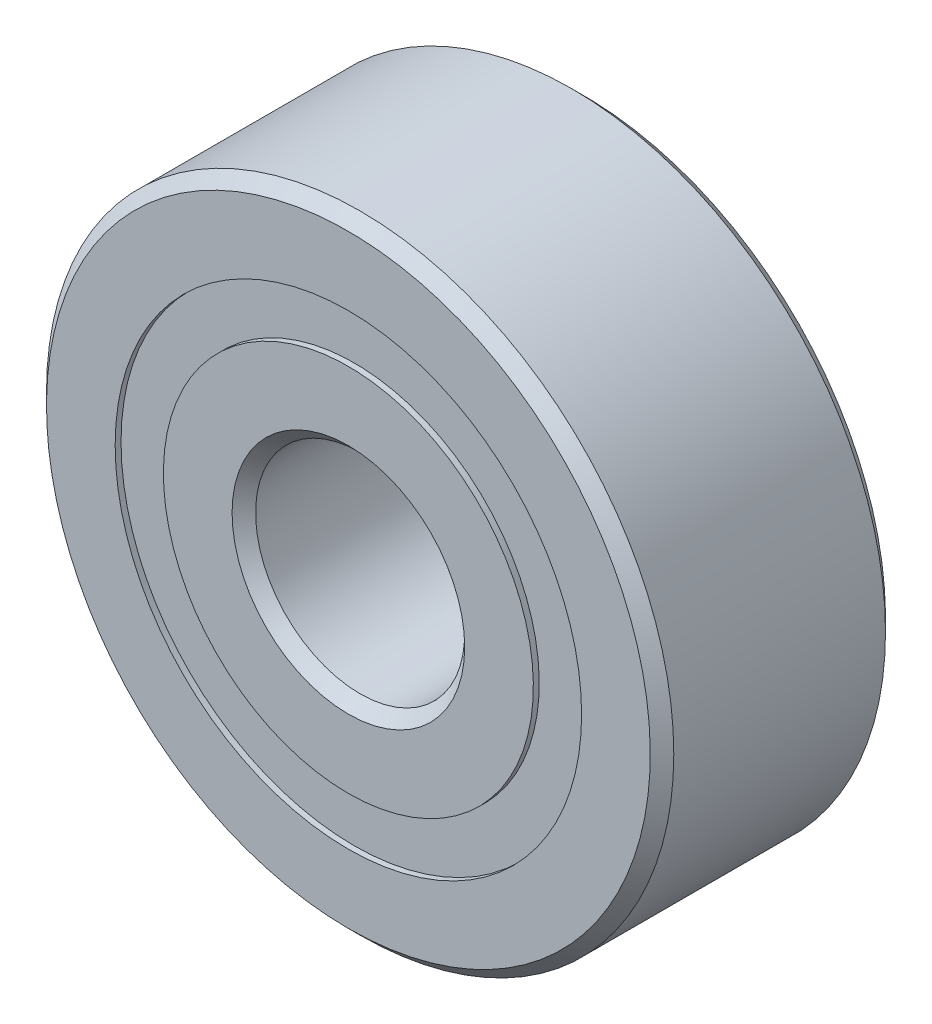
ISO-10303-21;
HEADER;
FILE_DESCRIPTION(('STEP AP214'),'2;1');
FILE_NAME('part.step','',(''),(''),'','','');
FILE_SCHEMA(('AUTOMOTIVE_DESIGN { 1 0 10303 214 1 1 1 1 }'));
ENDSEC;
DATA;
#1=APPLICATION_CONTEXT('core data for automotive mechanical design processes');
#2=APPLICATION_PROTOCOL_DEFINITION('international standard','automotive_design',2000,#1);
#3=PRODUCT_CONTEXT('',#1,'mechanical');
#4=PRODUCT('Part','Part','',(#3));
#5=PRODUCT_RELATED_PRODUCT_CATEGORY('part','',(#4));
#6=PRODUCT_DEFINITION_FORMATION('','',#4);
#7=PRODUCT_DEFINITION_CONTEXT('part definition',#1,'design');
#8=PRODUCT_DEFINITION('design','',#6,#7);
#9=PRODUCT_DEFINITION_SHAPE('','',#8);
#10=(LENGTH_UNIT() NAMED_UNIT(*) SI_UNIT(.MILLI.,.METRE.));
#11=(NAMED_UNIT(*) PLANE_ANGLE_UNIT() SI_UNIT($,.RADIAN.));
#12=(NAMED_UNIT(*) SI_UNIT($,.STERADIAN.) SOLID_ANGLE_UNIT());
#13=UNCERTAINTY_MEASURE_WITH_UNIT(LENGTH_MEASURE(1.E-05),#10,'distance_accuracy_value','');
#14=(GEOMETRIC_REPRESENTATION_CONTEXT(3) GLOBAL_UNCERTAINTY_ASSIGNED_CONTEXT((#13)) GLOBAL_UNIT_ASSIGNED_CONTEXT((#10,
#11,#12)) REPRESENTATION_CONTEXT('',''));
#15=CARTESIAN_POINT('',(0.,0.,0.));
#16=DIRECTION('',(0.,0.,1.));
#17=DIRECTION('',(1.,0.,0.));
#18=AXIS2_PLACEMENT_3D('',#15,#16,#17);
#19=CARTESIAN_POINT('',(0.,7.08269230769231,-3.39328125));
#20=DIRECTION('',(0.,0.,1.));
#21=DIRECTION('',(0.,-1.,0.));
#22=AXIS2_PLACEMENT_3D('',#19,#20,#21);
#23=PLANE('',#22);
#24=CARTESIAN_POINT('',(0.,0.,-3.39328125));
#25=DIRECTION('',(0.,0.,1.));
#26=DIRECTION('',(0.,-1.,0.));
#27=AXIS2_PLACEMENT_3D('',#24,#25,#26);
#28=CIRCLE('',#27,7.08269230769231);
#29=CARTESIAN_POINT('',(0.,-7.08269230769231,-3.39328125));
#30=VERTEX_POINT('',#29);
#31=EDGE_CURVE('E55',#30,#30,#28,.T.);
#32=ORIENTED_EDGE('',*,*,#31,.F.);
#33=EDGE_LOOP('',(#32));
#34=FACE_BOUND('',#33,.T.);
#35=CARTESIAN_POINT('',(0.,0.,-3.39328125));
#36=DIRECTION('',(0.,0.,1.));
#37=DIRECTION('',(0.,-1.,0.));
#38=AXIS2_PLACEMENT_3D('',#35,#36,#37);
#39=CIRCLE('',#38,5.61730769230769);
#40=CARTESIAN_POINT('',(0.,-5.61730769230769,-3.39328125));
#41=VERTEX_POINT('',#40);
#42=EDGE_CURVE('E11',#41,#41,#39,.T.);
#43=ORIENTED_EDGE('',*,*,#42,.T.);
#44=EDGE_LOOP('',(#43));
#45=FACE_BOUND('',#44,.T.);
#46=ADVANCED_FACE('F41',(#34,#45),#23,.F.);
#47=CARTESIAN_POINT('',(0.,0.,3.571875));
#48=DIRECTION('',(0.,0.,1.));
#49=DIRECTION('',(0.,-1.,0.));
#50=AXIS2_PLACEMENT_3D('',#47,#48,#49);
#51=CYLINDRICAL_SURFACE('',#50,5.61730769230769);
#52=ORIENTED_EDGE('',*,*,#42,.F.);
#53=EDGE_LOOP('',(#52));
#54=FACE_BOUND('',#53,.T.);
#55=CARTESIAN_POINT('',(0.,0.,-1.74842622599625));
#56=DIRECTION('',(0.,0.,1.));
#57=DIRECTION('',(0.,-1.,0.));
#58=AXIS2_PLACEMENT_3D('',#55,#56,#57);
#59=CIRCLE('',#58,5.61730769230769);
#60=CARTESIAN_POINT('',(0.,-5.61730769230769,-1.74842622599625));
#61=VERTEX_POINT('',#60);
#62=EDGE_CURVE('E47',#61,#61,#59,.T.);
#63=ORIENTED_EDGE('',*,*,#62,.T.);
#64=EDGE_LOOP('',(#63));
#65=FACE_BOUND('',#64,.T.);
#66=ADVANCED_FACE('F64',(#54,#65),#51,.F.);
#67=CARTESIAN_POINT('',(0.,7.08269230769231,-1.74842622599625));
#68=DIRECTION('',(0.,0.,-1.));
#69=DIRECTION('',(0.,1.,0.));
#70=AXIS2_PLACEMENT_3D('',#67,#68,#69);
#71=PLANE('',#70);
#72=ORIENTED_EDGE('',*,*,#62,.F.);
#73=EDGE_LOOP('',(#72));
#74=FACE_BOUND('',#73,.T.);
#75=CARTESIAN_POINT('',(0.,0.,-1.74842622599625));
#76=DIRECTION('',(0.,0.,1.));
#77=DIRECTION('',(0.,-1.,0.));
#78=AXIS2_PLACEMENT_3D('',#75,#76,#77);
#79=CIRCLE('',#78,7.08269230769231);
#80=CARTESIAN_POINT('',(0.,-7.08269230769231,-1.74842622599625));
#81=VERTEX_POINT('',#80);
#82=EDGE_CURVE('E51',#81,#81,#79,.T.);
#83=ORIENTED_EDGE('',*,*,#82,.T.);
#84=EDGE_LOOP('',(#83));
#85=FACE_BOUND('',#84,.T.);
#86=ADVANCED_FACE('F68',(#74,#85),#71,.F.);
#87=CARTESIAN_POINT('',(0.,0.,3.571875));
#88=DIRECTION('',(0.,0.,1.));
#89=DIRECTION('',(0.,-1.,0.));
#90=AXIS2_PLACEMENT_3D('',#87,#88,#89);
#91=CYLINDRICAL_SURFACE('',#90,7.08269230769231);
#92=ORIENTED_EDGE('',*,*,#82,.F.);
#93=EDGE_LOOP('',(#92));
#94=FACE_BOUND('',#93,.T.);
#95=ORIENTED_EDGE('',*,*,#31,.T.);
#96=EDGE_LOOP('',(#95));
#97=FACE_BOUND('',#96,.T.);
#98=ADVANCED_FACE('F61',(#94,#97),#91,.T.);
#99=CLOSED_SHELL('',(#46,#66,#86,#98));
#100=MANIFOLD_SOLID_BREP('B2',#99);
#101=CARTESIAN_POINT('',(0.,7.08269230769231,3.39328125));
#102=DIRECTION('',(0.,0.,-1.));
#103=DIRECTION('',(0.,1.,0.));
#104=AXIS2_PLACEMENT_3D('',#101,#102,#103);
#105=PLANE('',#104);
#106=CARTESIAN_POINT('',(0.,0.,3.39328125));
#107=DIRECTION('',(0.,0.,1.));
#108=DIRECTION('',(0.,-1.,0.));
#109=AXIS2_PLACEMENT_3D('',#106,#107,#108);
#110=CIRCLE('',#109,5.61730769230769);
#111=CARTESIAN_POINT('',(0.,-5.61730769230769,3.39328125));
#112=VERTEX_POINT('',#111);
#113=EDGE_CURVE('E40',#112,#112,#110,.T.);
#114=ORIENTED_EDGE('',*,*,#113,.F.);
#115=EDGE_LOOP('',(#114));
#116=FACE_BOUND('',#115,.T.);
#117=CARTESIAN_POINT('',(0.,0.,3.39328125));
#118=DIRECTION('',(0.,0.,1.));
#119=DIRECTION('',(0.,-1.,0.));
#120=AXIS2_PLACEMENT_3D('',#117,#118,#119);
#121=CIRCLE('',#120,7.08269230769231);
#122=CARTESIAN_POINT('',(0.,-7.08269230769231,3.39328125));
#123=VERTEX_POINT('',#122);
#124=EDGE_CURVE('E122',#123,#123,#121,.T.);
#125=ORIENTED_EDGE('',*,*,#124,.T.);
#126=EDGE_LOOP('',(#125));
#127=FACE_BOUND('',#126,.T.);
#128=ADVANCED_FACE('F108',(#116,#127),#105,.F.);
#129=CARTESIAN_POINT('',(0.,0.,3.571875));
#130=DIRECTION('',(0.,0.,1.));
#131=DIRECTION('',(0.,-1.,0.));
#132=AXIS2_PLACEMENT_3D('',#129,#130,#131);
#133=CYLINDRICAL_SURFACE('',#132,5.61730769230769);
#134=CARTESIAN_POINT('',(0.,0.,1.74842622599625));
#135=DIRECTION('',(0.,0.,1.));
#136=DIRECTION('',(0.,-1.,0.));
#137=AXIS2_PLACEMENT_3D('',#134,#135,#136);
#138=CIRCLE('',#137,5.61730769230769);
#139=CARTESIAN_POINT('',(0.,-5.61730769230769,1.74842622599624));
#140=VERTEX_POINT('',#139);
#141=EDGE_CURVE('E114',#140,#140,#138,.T.);
#142=ORIENTED_EDGE('',*,*,#141,.F.);
#143=EDGE_LOOP('',(#142));
#144=FACE_BOUND('',#143,.T.);
#145=ORIENTED_EDGE('',*,*,#113,.T.);
#146=EDGE_LOOP('',(#145));
#147=FACE_BOUND('',#146,.T.);
#148=ADVANCED_FACE('F137',(#144,#147),#133,.F.);
#149=CARTESIAN_POINT('',(0.,7.08269230769231,1.74842622599625));
#150=DIRECTION('',(0.,0.,1.));
#151=DIRECTION('',(0.,-1.,0.));
#152=AXIS2_PLACEMENT_3D('',#149,#150,#151);
#153=PLANE('',#152);
#154=CARTESIAN_POINT('',(0.,0.,1.74842622599625));
#155=DIRECTION('',(0.,0.,1.));
#156=DIRECTION('',(0.,-1.,0.));
#157=AXIS2_PLACEMENT_3D('',#154,#155,#156);
#158=CIRCLE('',#157,7.08269230769231);
#159=CARTESIAN_POINT('',(0.,-7.08269230769231,1.74842622599624));
#160=VERTEX_POINT('',#159);
#161=EDGE_CURVE('E118',#160,#160,#158,.T.);
#162=ORIENTED_EDGE('',*,*,#161,.F.);
#163=EDGE_LOOP('',(#162));
#164=FACE_BOUND('',#163,.T.);
#165=ORIENTED_EDGE('',*,*,#141,.T.);
#166=EDGE_LOOP('',(#165));
#167=FACE_BOUND('',#166,.T.);
#168=ADVANCED_FACE('F132',(#164,#167),#153,.F.);
#169=CARTESIAN_POINT('',(0.,0.,3.571875));
#170=DIRECTION('',(0.,0.,1.));
#171=DIRECTION('',(0.,-1.,0.));
#172=AXIS2_PLACEMENT_3D('',#169,#170,#171);
#173=CYLINDRICAL_SURFACE('',#172,7.08269230769231);
#174=ORIENTED_EDGE('',*,*,#124,.F.);
#175=EDGE_LOOP('',(#174));
#176=FACE_BOUND('',#175,.T.);
#177=ORIENTED_EDGE('',*,*,#161,.T.);
#178=EDGE_LOOP('',(#177));
#179=FACE_BOUND('',#178,.T.);
#180=ADVANCED_FACE('F129',(#176,#179),#173,.T.);
#181=CLOSED_SHELL('',(#128,#148,#168,#180));
#182=MANIFOLD_SOLID_BREP('B6',#181);
#183=CARTESIAN_POINT('',(-4.49012806053452,4.49012806053463,0.));
#184=DIRECTION('',(0.,0.,1.));
#185=DIRECTION('',(-0.707106781186539,0.707106781186556,0.));
#186=AXIS2_PLACEMENT_3D('',#183,#184,#185);
#187=SPHERICAL_SURFACE('',#186,1.74842622599625);
#188=CARTESIAN_POINT('',(-4.49012806053452,4.49012806053463,1.74842622599625));
#189=VERTEX_POINT('',#188);
#190=VERTEX_LOOP('',#189);
#191=FACE_BOUND('',#190,.T.);
#192=ADVANCED_FACE('F188',(#191),#187,.T.);
#193=CLOSED_SHELL('',(#192));
#194=MANIFOLD_SOLID_BREP('B35',#193);
#195=CARTESIAN_POINT('',(-6.35,0.,0.));
#196=DIRECTION('',(0.,0.,1.));
#197=DIRECTION('',(-1.,0.,0.));
#198=AXIS2_PLACEMENT_3D('',#195,#196,#197);
#199=SPHERICAL_SURFACE('',#198,1.74842622599625);
#200=CARTESIAN_POINT('',(-6.35,0.,1.74842622599625));
#201=VERTEX_POINT('',#200);
#202=VERTEX_LOOP('',#201);
#203=FACE_BOUND('',#202,.T.);
#204=ADVANCED_FACE('F206',(#203),#199,.T.);
#205=CLOSED_SHELL('',(#204));
#206=MANIFOLD_SOLID_BREP('B104',#205);
#207=CARTESIAN_POINT('',(-4.49012806053462,-4.49012806053454,0.));
#208=DIRECTION('',(0.,0.,1.));
#209=DIRECTION('',(-0.707106781186554,-0.707106781186541,0.));
#210=AXIS2_PLACEMENT_3D('',#207,#208,#209);
#211=SPHERICAL_SURFACE('',#210,1.74842622599625);
#212=CARTESIAN_POINT('',(-4.49012806053462,-4.49012806053454,1.74842622599624));
#213=VERTEX_POINT('',#212);
#214=VERTEX_LOOP('',#213);
#215=FACE_BOUND('',#214,.T.);
#216=ADVANCED_FACE('F224',(#215),#211,.T.);
#217=CLOSED_SHELL('',(#216));
#218=MANIFOLD_SOLID_BREP('B184',#217);
#219=CARTESIAN_POINT('',(0.,-6.35,0.));
#220=DIRECTION('',(0.,0.,1.));
#221=DIRECTION('',(0.,-1.,0.));
#222=AXIS2_PLACEMENT_3D('',#219,#220,#221);
#223=SPHERICAL_SURFACE('',#222,1.74842622599625);
#224=CARTESIAN_POINT('',(0.,-6.35,1.74842622599624));
#225=VERTEX_POINT('',#224);
#226=VERTEX_LOOP('',#225);
#227=FACE_BOUND('',#226,.T.);
#228=ADVANCED_FACE('F242',(#227),#223,.T.);
#229=CLOSED_SHELL('',(#228));
#230=MANIFOLD_SOLID_BREP('B202',#229);
#231=CARTESIAN_POINT('',(4.49012806053455,-4.4901280605346,0.));
#232=DIRECTION('',(0.,0.,1.));
#233=DIRECTION('',(0.707106781186544,-0.707106781186551,0.));
#234=AXIS2_PLACEMENT_3D('',#231,#232,#233);
#235=SPHERICAL_SURFACE('',#234,1.74842622599625);
#236=CARTESIAN_POINT('',(4.49012806053455,-4.4901280605346,1.74842622599624));
#237=VERTEX_POINT('',#236);
#238=VERTEX_LOOP('',#237);
#239=FACE_BOUND('',#238,.T.);
#240=ADVANCED_FACE('F260',(#239),#235,.T.);
#241=CLOSED_SHELL('',(#240));
#242=MANIFOLD_SOLID_BREP('B220',#241);
#243=CARTESIAN_POINT('',(6.35,0.,0.));
#244=DIRECTION('',(0.,0.,1.));
#245=DIRECTION('',(1.,0.,0.));
#246=AXIS2_PLACEMENT_3D('',#243,#244,#245);
#247=SPHERICAL_SURFACE('',#246,1.74842622599625);
#248=CARTESIAN_POINT('',(6.35,0.,1.74842622599625));
#249=VERTEX_POINT('',#248);
#250=VERTEX_LOOP('',#249);
#251=FACE_BOUND('',#250,.T.);
#252=ADVANCED_FACE('F278',(#251),#247,.T.);
#253=CLOSED_SHELL('',(#252));
#254=MANIFOLD_SOLID_BREP('B238',#253);
#255=CARTESIAN_POINT('',(4.49012806053459,4.49012806053457,0.));
#256=DIRECTION('',(0.,0.,1.));
#257=DIRECTION('',(0.707106781186549,0.707106781186546,0.));
#258=AXIS2_PLACEMENT_3D('',#255,#256,#257);
#259=SPHERICAL_SURFACE('',#258,1.74842622599625);
#260=CARTESIAN_POINT('',(4.49012806053459,4.49012806053457,1.74842622599625));
#261=VERTEX_POINT('',#260);
#262=VERTEX_LOOP('',#261);
#263=FACE_BOUND('',#262,.T.);
#264=ADVANCED_FACE('F296',(#263),#259,.T.);
#265=CLOSED_SHELL('',(#264));
#266=MANIFOLD_SOLID_BREP('B256',#265);
#267=CARTESIAN_POINT('',(0.,6.35,0.));
#268=DIRECTION('',(0.,0.,1.));
#269=DIRECTION('',(0.,1.,0.));
#270=AXIS2_PLACEMENT_3D('',#267,#268,#269);
#271=SPHERICAL_SURFACE('',#270,1.74842622599625);
#272=CARTESIAN_POINT('',(0.,6.35,1.74842622599625));
#273=VERTEX_POINT('',#272);
#274=VERTEX_LOOP('',#273);
#275=FACE_BOUND('',#274,.T.);
#276=ADVANCED_FACE('F316',(#275),#271,.T.);
#277=CLOSED_SHELL('',(#276));
#278=MANIFOLD_SOLID_BREP('B274',#277);
#279=CARTESIAN_POINT('',(0.,3.53218749999999,3.571875));
#280=DIRECTION('',(0.,0.,-1.));
#281=DIRECTION('',(0.,1.,0.));
#282=AXIS2_PLACEMENT_3D('',#279,#280,#281);
#283=PLANE('',#282);
#284=CARTESIAN_POINT('',(0.,0.,3.571875));
#285=DIRECTION('',(0.,0.,1.));
#286=DIRECTION('',(0.,-1.,0.));
#287=AXIS2_PLACEMENT_3D('',#284,#285,#286);
#288=CIRCLE('',#287,3.53218749999999);
#289=CARTESIAN_POINT('',(0.,-3.53218749999999,3.571875));
#290=VERTEX_POINT('',#289);
#291=EDGE_CURVE('E363',#290,#290,#288,.T.);
#292=ORIENTED_EDGE('',*,*,#291,.F.);
#293=EDGE_LOOP('',(#292));
#294=FACE_BOUND('',#293,.T.);
#295=CARTESIAN_POINT('',(0.,0.,3.571875));
#296=DIRECTION('',(0.,0.,1.));
#297=DIRECTION('',(0.,-1.,0.));
#298=AXIS2_PLACEMENT_3D('',#295,#296,#297);
#299=CIRCLE('',#298,5.61730769230769);
#300=CARTESIAN_POINT('',(0.,-5.61730769230769,3.571875));
#301=VERTEX_POINT('',#300);
#302=EDGE_CURVE('E315',#301,#301,#299,.T.);
#303=ORIENTED_EDGE('',*,*,#302,.T.);
#304=EDGE_LOOP('',(#303));
#305=FACE_BOUND('',#304,.T.);
#306=ADVANCED_FACE('F335',(#294,#305),#283,.F.);
#307=CARTESIAN_POINT('',(0.,0.,3.571875));
#308=DIRECTION('',(0.,0.,1.));
#309=DIRECTION('',(0.,-1.,0.));
#310=AXIS2_PLACEMENT_3D('',#307,#308,#309);
#311=CYLINDRICAL_SURFACE('',#310,5.61730769230769);
#312=ORIENTED_EDGE('',*,*,#302,.F.);
#313=EDGE_LOOP('',(#312));
#314=FACE_BOUND('',#313,.T.);
#315=CARTESIAN_POINT('',(0.,0.,1.5875));
#316=DIRECTION('',(0.,0.,1.));
#317=DIRECTION('',(0.,-1.,0.));
#318=AXIS2_PLACEMENT_3D('',#315,#316,#317);
#319=CIRCLE('',#318,5.61730769230769);
#320=CARTESIAN_POINT('',(0.,-5.61730769230769,1.5875));
#321=VERTEX_POINT('',#320);
#322=EDGE_CURVE('E341',#321,#321,#319,.T.);
#323=ORIENTED_EDGE('',*,*,#322,.T.);
#324=EDGE_LOOP('',(#323));
#325=FACE_BOUND('',#324,.T.);
#326=ADVANCED_FACE('F370',(#314,#325),#311,.T.);
#327=CARTESIAN_POINT('',(0.,0.,0.));
#328=DIRECTION('',(0.,0.,1.));
#329=DIRECTION('',(0.,-1.,0.));
#330=AXIS2_PLACEMENT_3D('',#327,#328,#329);
#331=TOROIDAL_SURFACE('',#330,6.35,1.74842622599625);
#332=ORIENTED_EDGE('',*,*,#322,.F.);
#333=EDGE_LOOP('',(#332));
#334=FACE_BOUND('',#333,.T.);
#335=CARTESIAN_POINT('',(0.,0.,-1.5875));
#336=DIRECTION('',(0.,0.,1.));
#337=DIRECTION('',(0.,-1.,0.));
#338=AXIS2_PLACEMENT_3D('',#335,#336,#337);
#339=CIRCLE('',#338,5.61730769230769);
#340=CARTESIAN_POINT('',(0.,-5.61730769230769,-1.5875));
#341=VERTEX_POINT('',#340);
#342=EDGE_CURVE('E345',#341,#341,#339,.T.);
#343=ORIENTED_EDGE('',*,*,#342,.T.);
#344=EDGE_LOOP('',(#343));
#345=FACE_BOUND('',#344,.T.);
#346=ADVANCED_FACE('F374',(#334,#345),#331,.F.);
#347=CARTESIAN_POINT('',(0.,0.,3.571875));
#348=DIRECTION('',(0.,0.,1.));
#349=DIRECTION('',(0.,-1.,0.));
#350=AXIS2_PLACEMENT_3D('',#347,#348,#349);
#351=CYLINDRICAL_SURFACE('',#350,5.61730769230769);
#352=ORIENTED_EDGE('',*,*,#342,.F.);
#353=EDGE_LOOP('',(#352));
#354=FACE_BOUND('',#353,.T.);
#355=CARTESIAN_POINT('',(0.,0.,-3.57187500000001));
#356=DIRECTION('',(0.,0.,1.));
#357=DIRECTION('',(0.,-1.,0.));
#358=AXIS2_PLACEMENT_3D('',#355,#356,#357);
#359=CIRCLE('',#358,5.61730769230769);
#360=CARTESIAN_POINT('',(0.,-5.61730769230769,-3.57187500000001));
#361=VERTEX_POINT('',#360);
#362=EDGE_CURVE('E349',#361,#361,#359,.T.);
#363=ORIENTED_EDGE('',*,*,#362,.T.);
#364=EDGE_LOOP('',(#363));
#365=FACE_BOUND('',#364,.T.);
#366=ADVANCED_FACE('F379',(#354,#365),#351,.T.);
#367=CARTESIAN_POINT('',(0.,3.53218749999999,-3.571875));
#368=DIRECTION('',(0.,0.,1.));
#369=DIRECTION('',(0.,-1.,0.));
#370=AXIS2_PLACEMENT_3D('',#367,#368,#369);
#371=PLANE('',#370);
#372=ORIENTED_EDGE('',*,*,#362,.F.);
#373=EDGE_LOOP('',(#372));
#374=FACE_BOUND('',#373,.T.);
#375=CARTESIAN_POINT('',(0.,0.,-3.57187500000001));
#376=DIRECTION('',(0.,0.,1.));
#377=DIRECTION('',(0.,-1.,0.));
#378=AXIS2_PLACEMENT_3D('',#375,#376,#377);
#379=CIRCLE('',#378,3.53218749999999);
#380=CARTESIAN_POINT('',(0.,-3.53218749999999,-3.57187500000001));
#381=VERTEX_POINT('',#380);
#382=EDGE_CURVE('E354',#381,#381,#379,.T.);
#383=ORIENTED_EDGE('',*,*,#382,.T.);
#384=EDGE_LOOP('',(#383));
#385=FACE_BOUND('',#384,.T.);
#386=ADVANCED_FACE('F385',(#374,#385),#371,.F.);
#387=CARTESIAN_POINT('',(0.,0.,-3.2146875));
#388=DIRECTION('',(0.,0.,-1.));
#389=DIRECTION('',(0.,1.,0.));
#390=AXIS2_PLACEMENT_3D('',#387,#388,#389);
#391=CONICAL_SURFACE('',#390,3.175,0.785398163397434);
#392=ORIENTED_EDGE('',*,*,#382,.F.);
#393=EDGE_LOOP('',(#392));
#394=FACE_BOUND('',#393,.T.);
#395=CARTESIAN_POINT('',(0.,0.,-3.2146875));
#396=DIRECTION('',(0.,0.,1.));
#397=DIRECTION('',(0.,-1.,0.));
#398=AXIS2_PLACEMENT_3D('',#395,#396,#397);
#399=CIRCLE('',#398,3.175);
#400=CARTESIAN_POINT('',(0.,-3.175,-3.2146875));
#401=VERTEX_POINT('',#400);
#402=EDGE_CURVE('E357',#401,#401,#399,.T.);
#403=ORIENTED_EDGE('',*,*,#402,.T.);
#404=EDGE_LOOP('',(#403));
#405=FACE_BOUND('',#404,.T.);
#406=ADVANCED_FACE('F389',(#394,#405),#391,.F.);
#407=CARTESIAN_POINT('',(0.,0.,3.571875));
#408=DIRECTION('',(0.,0.,1.));
#409=DIRECTION('',(0.,-1.,0.));
#410=AXIS2_PLACEMENT_3D('',#407,#408,#409);
#411=CYLINDRICAL_SURFACE('',#410,3.175);
#412=ORIENTED_EDGE('',*,*,#402,.F.);
#413=EDGE_LOOP('',(#412));
#414=FACE_BOUND('',#413,.T.);
#415=CARTESIAN_POINT('',(0.,0.,3.2146875));
#416=DIRECTION('',(0.,0.,1.));
#417=DIRECTION('',(0.,-1.,0.));
#418=AXIS2_PLACEMENT_3D('',#415,#416,#417);
#419=CIRCLE('',#418,3.175);
#420=CARTESIAN_POINT('',(0.,-3.175,3.2146875));
#421=VERTEX_POINT('',#420);
#422=EDGE_CURVE('E360',#421,#421,#419,.T.);
#423=ORIENTED_EDGE('',*,*,#422,.T.);
#424=EDGE_LOOP('',(#423));
#425=FACE_BOUND('',#424,.T.);
#426=ADVANCED_FACE('F393',(#414,#425),#411,.F.);
#427=CARTESIAN_POINT('',(0.,0.,3.571875));
#428=DIRECTION('',(0.,0.,1.));
#429=DIRECTION('',(0.,-1.,0.));
#430=AXIS2_PLACEMENT_3D('',#427,#428,#429);
#431=CONICAL_SURFACE('',#430,3.53218749999999,0.785398163397434);
#432=ORIENTED_EDGE('',*,*,#422,.F.);
#433=EDGE_LOOP('',(#432));
#434=FACE_BOUND('',#433,.T.);
#435=ORIENTED_EDGE('',*,*,#291,.T.);
#436=EDGE_LOOP('',(#435));
#437=FACE_BOUND('',#436,.T.);
#438=ADVANCED_FACE('F367',(#434,#437),#431,.F.);
#439=CLOSED_SHELL('',(#306,#326,#346,#366,#386,#406,#426,#438));
#440=MANIFOLD_SOLID_BREP('B292',#439);
#441=CARTESIAN_POINT('',(0.,0.,3.571875));
#442=DIRECTION('',(0.,0.,1.));
#443=DIRECTION('',(0.,-1.,0.));
#444=AXIS2_PLACEMENT_3D('',#441,#442,#443);
#445=CYLINDRICAL_SURFACE('',#444,9.525);
#446=CARTESIAN_POINT('',(0.,0.,3.2146875));
#447=DIRECTION('',(0.,0.,1.));
#448=DIRECTION('',(0.,-1.,0.));
#449=AXIS2_PLACEMENT_3D('',#446,#447,#448);
#450=CIRCLE('',#449,9.525);
#451=CARTESIAN_POINT('',(0.,-9.525,3.2146875));
#452=VERTEX_POINT('',#451);
#453=EDGE_CURVE('E334',#452,#452,#450,.T.);
#454=ORIENTED_EDGE('',*,*,#453,.F.);
#455=EDGE_LOOP('',(#454));
#456=FACE_BOUND('',#455,.T.);
#457=CARTESIAN_POINT('',(0.,0.,-3.2146875));
#458=DIRECTION('',(0.,0.,1.));
#459=DIRECTION('',(0.,-1.,0.));
#460=AXIS2_PLACEMENT_3D('',#457,#458,#459);
#461=CIRCLE('',#460,9.525);
#462=CARTESIAN_POINT('',(0.,-9.525,-3.2146875));
#463=VERTEX_POINT('',#462);
#464=EDGE_CURVE('E484',#463,#463,#461,.T.);
#465=ORIENTED_EDGE('',*,*,#464,.T.);
#466=EDGE_LOOP('',(#465));
#467=FACE_BOUND('',#466,.T.);
#468=ADVANCED_FACE('F456',(#456,#467),#445,.T.);
#469=CARTESIAN_POINT('',(0.,0.,3.2146875));
#470=DIRECTION('',(0.,0.,-1.));
#471=DIRECTION('',(0.,1.,0.));
#472=AXIS2_PLACEMENT_3D('',#469,#470,#471);
#473=CONICAL_SURFACE('',#472,9.525,0.785398163397446);
#474=CARTESIAN_POINT('',(0.,0.,3.571875));
#475=DIRECTION('',(0.,0.,1.));
#476=DIRECTION('',(0.,-1.,0.));
#477=AXIS2_PLACEMENT_3D('',#474,#475,#476);
#478=CIRCLE('',#477,9.1678125);
#479=CARTESIAN_POINT('',(0.,-9.1678125,3.571875));
#480=VERTEX_POINT('',#479);
#481=EDGE_CURVE('E462',#480,#480,#478,.T.);
#482=ORIENTED_EDGE('',*,*,#481,.F.);
#483=EDGE_LOOP('',(#482));
#484=FACE_BOUND('',#483,.T.);
#485=ORIENTED_EDGE('',*,*,#453,.T.);
#486=EDGE_LOOP('',(#485));
#487=FACE_BOUND('',#486,.T.);
#488=ADVANCED_FACE('F521',(#484,#487),#473,.T.);
#489=CARTESIAN_POINT('',(0.,9.1678125,3.571875));
#490=DIRECTION('',(0.,0.,-1.));
#491=DIRECTION('',(0.,1.,0.));
#492=AXIS2_PLACEMENT_3D('',#489,#490,#491);
#493=PLANE('',#492);
#494=CARTESIAN_POINT('',(0.,0.,3.571875));
#495=DIRECTION('',(0.,0.,1.));
#496=DIRECTION('',(0.,-1.,0.));
#497=AXIS2_PLACEMENT_3D('',#494,#495,#496);
#498=CIRCLE('',#497,7.08269230769231);
#499=CARTESIAN_POINT('',(0.,-7.08269230769231,3.571875));
#500=VERTEX_POINT('',#499);
#501=EDGE_CURVE('E466',#500,#500,#498,.T.);
#502=ORIENTED_EDGE('',*,*,#501,.F.);
#503=EDGE_LOOP('',(#502));
#504=FACE_BOUND('',#503,.T.);
#505=ORIENTED_EDGE('',*,*,#481,.T.);
#506=EDGE_LOOP('',(#505));
#507=FACE_BOUND('',#506,.T.);
#508=ADVANCED_FACE('F516',(#504,#507),#493,.F.);
#509=CARTESIAN_POINT('',(0.,0.,3.571875));
#510=DIRECTION('',(0.,0.,1.));
#511=DIRECTION('',(0.,-1.,0.));
#512=AXIS2_PLACEMENT_3D('',#509,#510,#511);
#513=CYLINDRICAL_SURFACE('',#512,7.08269230769231);
#514=CARTESIAN_POINT('',(0.,0.,1.5875));
#515=DIRECTION('',(0.,0.,1.));
#516=DIRECTION('',(0.,-1.,0.));
#517=AXIS2_PLACEMENT_3D('',#514,#515,#516);
#518=CIRCLE('',#517,7.08269230769231);
#519=CARTESIAN_POINT('',(0.,-7.08269230769231,1.5875));
#520=VERTEX_POINT('',#519);
#521=EDGE_CURVE('E470',#520,#520,#518,.T.);
#522=ORIENTED_EDGE('',*,*,#521,.F.);
#523=EDGE_LOOP('',(#522));
#524=FACE_BOUND('',#523,.T.);
#525=ORIENTED_EDGE('',*,*,#501,.T.);
#526=EDGE_LOOP('',(#525));
#527=FACE_BOUND('',#526,.T.);
#528=ADVANCED_FACE('F510',(#524,#527),#513,.F.);
#529=CARTESIAN_POINT('',(0.,0.,0.));
#530=DIRECTION('',(0.,0.,1.));
#531=DIRECTION('',(0.,-1.,0.));
#532=AXIS2_PLACEMENT_3D('',#529,#530,#531);
#533=TOROIDAL_SURFACE('',#532,6.35,1.74842622599625);
#534=CARTESIAN_POINT('',(0.,0.,-1.5875));
#535=DIRECTION('',(0.,0.,1.));
#536=DIRECTION('',(0.,-1.,0.));
#537=AXIS2_PLACEMENT_3D('',#534,#535,#536);
#538=CIRCLE('',#537,7.08269230769231);
#539=CARTESIAN_POINT('',(0.,-7.08269230769231,-1.5875));
#540=VERTEX_POINT('',#539);
#541=EDGE_CURVE('E475',#540,#540,#538,.T.);
#542=ORIENTED_EDGE('',*,*,#541,.F.);
#543=EDGE_LOOP('',(#542));
#544=FACE_BOUND('',#543,.T.);
#545=ORIENTED_EDGE('',*,*,#521,.T.);
#546=EDGE_LOOP('',(#545));
#547=FACE_BOUND('',#546,.T.);
#548=ADVANCED_FACE('F504',(#544,#547),#533,.F.);
#549=CARTESIAN_POINT('',(0.,0.,3.571875));
#550=DIRECTION('',(0.,0.,1.));
#551=DIRECTION('',(0.,-1.,0.));
#552=AXIS2_PLACEMENT_3D('',#549,#550,#551);
#553=CYLINDRICAL_SURFACE('',#552,7.08269230769231);
#554=CARTESIAN_POINT('',(0.,0.,-3.571875));
#555=DIRECTION('',(0.,0.,1.));
#556=DIRECTION('',(0.,-1.,0.));
#557=AXIS2_PLACEMENT_3D('',#554,#555,#556);
#558=CIRCLE('',#557,7.08269230769231);
#559=CARTESIAN_POINT('',(0.,-7.0826923076923,-3.571875));
#560=VERTEX_POINT('',#559);
#561=EDGE_CURVE('E478',#560,#560,#558,.T.);
#562=ORIENTED_EDGE('',*,*,#561,.F.);
#563=EDGE_LOOP('',(#562));
#564=FACE_BOUND('',#563,.T.);
#565=ORIENTED_EDGE('',*,*,#541,.T.);
#566=EDGE_LOOP('',(#565));
#567=FACE_BOUND('',#566,.T.);
#568=ADVANCED_FACE('F498',(#564,#567),#553,.F.);
#569=CARTESIAN_POINT('',(0.,9.1678125,-3.571875));
#570=DIRECTION('',(0.,0.,1.));
#571=DIRECTION('',(0.,-1.,0.));
#572=AXIS2_PLACEMENT_3D('',#569,#570,#571);
#573=PLANE('',#572);
#574=CARTESIAN_POINT('',(0.,0.,-3.571875));
#575=DIRECTION('',(0.,0.,1.));
#576=DIRECTION('',(0.,-1.,0.));
#577=AXIS2_PLACEMENT_3D('',#574,#575,#576);
#578=CIRCLE('',#577,9.1678125);
#579=CARTESIAN_POINT('',(0.,-9.1678125,-3.571875));
#580=VERTEX_POINT('',#579);
#581=EDGE_CURVE('E481',#580,#580,#578,.T.);
#582=ORIENTED_EDGE('',*,*,#581,.F.);
#583=EDGE_LOOP('',(#582));
#584=FACE_BOUND('',#583,.T.);
#585=ORIENTED_EDGE('',*,*,#561,.T.);
#586=EDGE_LOOP('',(#585));
#587=FACE_BOUND('',#586,.T.);
#588=ADVANCED_FACE('F492',(#584,#587),#573,.F.);
#589=CARTESIAN_POINT('',(0.,0.,-3.571875));
#590=DIRECTION('',(0.,0.,1.));
#591=DIRECTION('',(0.,-1.,0.));
#592=AXIS2_PLACEMENT_3D('',#589,#590,#591);
#593=CONICAL_SURFACE('',#592,9.1678125,0.785398163397444);
#594=ORIENTED_EDGE('',*,*,#464,.F.);
#595=EDGE_LOOP('',(#594));
#596=FACE_BOUND('',#595,.T.);
#597=ORIENTED_EDGE('',*,*,#581,.T.);
#598=EDGE_LOOP('',(#597));
#599=FACE_BOUND('',#598,.T.);
#600=ADVANCED_FACE('F489',(#596,#599),#593,.T.);
#601=CLOSED_SHELL('',(#468,#488,#508,#528,#548,#568,#588,#600));
#602=MANIFOLD_SOLID_BREP('B310',#601);
#603=ADVANCED_BREP_SHAPE_REPRESENTATION('',(#18,#100,#182,#194,#206,#218,#230,#242,#254,#266,
#278,#440,#602),#14);
#604=SHAPE_DEFINITION_REPRESENTATION(#9,#603);
ENDSEC;
END-ISO-10303-21;
